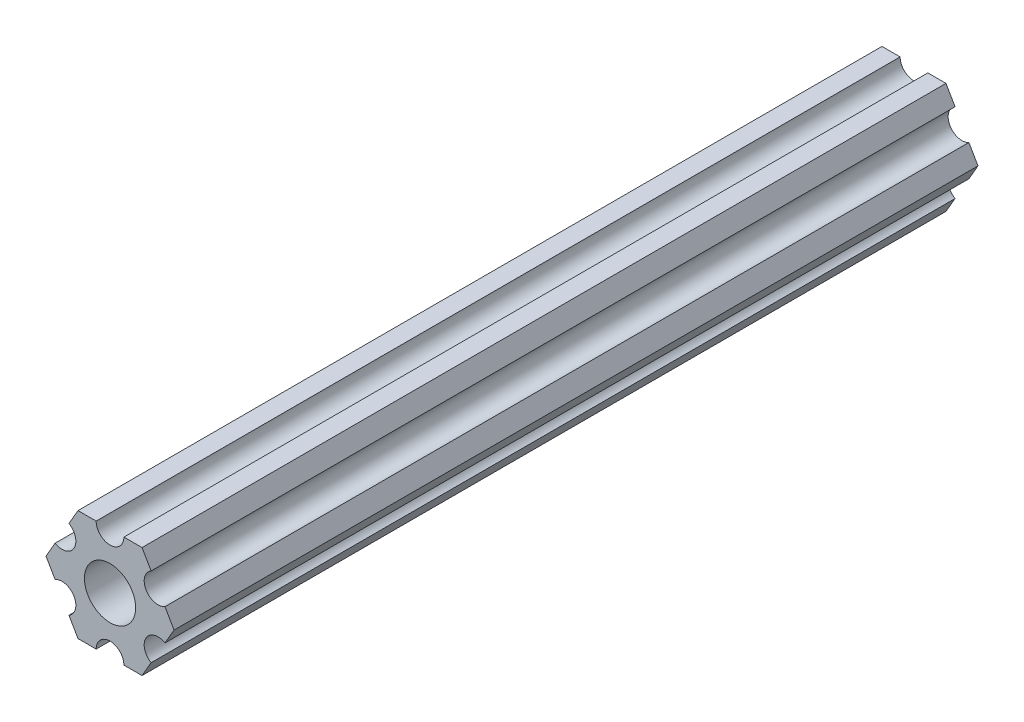
ISO-10303-21;
HEADER;
FILE_DESCRIPTION(('STEP AP214'),'2;1');
FILE_NAME('part.step','',(''),(''),'','','');
FILE_SCHEMA(('AUTOMOTIVE_DESIGN { 1 0 10303 214 1 1 1 1 }'));
ENDSEC;
DATA;
#1=APPLICATION_CONTEXT('core data for automotive mechanical design processes');
#2=APPLICATION_PROTOCOL_DEFINITION('international standard','automotive_design',2000,#1);
#3=PRODUCT_CONTEXT('',#1,'mechanical');
#4=PRODUCT('Part','Part','',(#3));
#5=PRODUCT_RELATED_PRODUCT_CATEGORY('part','',(#4));
#6=PRODUCT_DEFINITION_FORMATION('','',#4);
#7=PRODUCT_DEFINITION_CONTEXT('part definition',#1,'design');
#8=PRODUCT_DEFINITION('design','',#6,#7);
#9=PRODUCT_DEFINITION_SHAPE('','',#8);
#10=(LENGTH_UNIT() NAMED_UNIT(*) SI_UNIT(.MILLI.,.METRE.));
#11=(NAMED_UNIT(*) PLANE_ANGLE_UNIT() SI_UNIT($,.RADIAN.));
#12=(NAMED_UNIT(*) SI_UNIT($,.STERADIAN.) SOLID_ANGLE_UNIT());
#13=UNCERTAINTY_MEASURE_WITH_UNIT(LENGTH_MEASURE(1.E-05),#10,'distance_accuracy_value','');
#14=(GEOMETRIC_REPRESENTATION_CONTEXT(3) GLOBAL_UNCERTAINTY_ASSIGNED_CONTEXT((#13)) GLOBAL_UNIT_ASSIGNED_CONTEXT((#10,
#11,#12)) REPRESENTATION_CONTEXT('',''));
#15=CARTESIAN_POINT('',(0.,0.,0.));
#16=DIRECTION('',(0.,0.,1.));
#17=DIRECTION('',(1.,0.,0.));
#18=AXIS2_PLACEMENT_3D('',#15,#16,#17);
#19=CARTESIAN_POINT('',(6.29301142309098,-1.80018429024546,514.35));
#20=DIRECTION('',(-0.866025434075723,0.499999947533953,0.));
#21=DIRECTION('',(-0.499999947533953,-0.866025434075723,0.));
#22=AXIS2_PLACEMENT_3D('',#19,#20,#21);
#23=PLANE('',#22);
#24=DIRECTION('',(0.499999947533952,0.866025434075723,0.));
#25=VECTOR('',#24,1.);
#26=CARTESIAN_POINT('',(6.29301142309098,-1.80018429024546,92.075));
#27=LINE('',#26,#25);
#28=CARTESIAN_POINT('',(6.29301142309098,-1.80018429024546,92.075));
#29=VERTEX_POINT('',#28);
#30=CARTESIAN_POINT('',(7.33234841870826,4.44212519315656E-07,92.075));
#31=VERTEX_POINT('',#30);
#32=EDGE_CURVE('E349',#29,#31,#27,.T.);
#33=ORIENTED_EDGE('',*,*,#32,.F.);
#34=DIRECTION('',(0.,0.,-1.));
#35=VECTOR('',#34,1.);
#36=CARTESIAN_POINT('',(6.29301142309098,-1.80018429024546,514.35));
#37=LINE('',#36,#35);
#38=CARTESIAN_POINT('',(6.29301142309098,-1.80018429024546,0.));
#39=VERTEX_POINT('',#38);
#40=EDGE_CURVE('E59',#29,#39,#37,.T.);
#41=ORIENTED_EDGE('',*,*,#40,.T.);
#42=DIRECTION('',(0.499999947533953,0.866025434075723,0.));
#43=VECTOR('',#42,1.);
#44=CARTESIAN_POINT('',(6.29301142309098,-1.80018429024546,0.));
#45=LINE('',#44,#43);
#46=CARTESIAN_POINT('',(7.33234841870826,4.44212518961143E-07,0.));
#47=VERTEX_POINT('',#46);
#48=EDGE_CURVE('E42',#39,#47,#45,.T.);
#49=ORIENTED_EDGE('',*,*,#48,.T.);
#50=DIRECTION('',(0.,0.,1.));
#51=VECTOR('',#50,1.);
#52=CARTESIAN_POINT('',(7.33234841870826,4.44212519169686E-07,514.35));
#53=LINE('',#52,#51);
#54=EDGE_CURVE('E221',#47,#31,#53,.T.);
#55=ORIENTED_EDGE('',*,*,#54,.T.);
#56=EDGE_LOOP('',(#33,#41,#49,#55));
#57=FACE_BOUND('',#56,.T.);
#58=ADVANCED_FACE('F34',(#57),#23,.F.);
#59=CARTESIAN_POINT('',(7.33234841870826,4.44212519169686E-07,514.35));
#60=DIRECTION('',(-0.866025373493145,-0.500000052466056,0.));
#61=DIRECTION('',(0.500000052466056,-0.866025373493145,0.));
#62=AXIS2_PLACEMENT_3D('',#59,#60,#61);
#63=PLANE('',#62);
#64=DIRECTION('',(-0.500000052466056,0.866025373493145,0.));
#65=VECTOR('',#64,1.);
#66=CARTESIAN_POINT('',(7.33234841870826,4.44212519315656E-07,92.075));
#67=LINE('',#66,#65);
#68=CARTESIAN_POINT('',(6.29301120497139,1.80018505273895,92.075));
#69=VERTEX_POINT('',#68);
#70=EDGE_CURVE('E348',#31,#69,#67,.T.);
#71=ORIENTED_EDGE('',*,*,#70,.F.);
#72=ORIENTED_EDGE('',*,*,#54,.F.);
#73=DIRECTION('',(-0.500000052466056,0.866025373493145,0.));
#74=VECTOR('',#73,1.);
#75=CARTESIAN_POINT('',(7.33234841870826,4.44212519198905E-07,0.));
#76=LINE('',#75,#74);
#77=CARTESIAN_POINT('',(6.29301120497139,1.80018505273895,0.));
#78=VERTEX_POINT('',#77);
#79=EDGE_CURVE('E261',#47,#78,#76,.T.);
#80=ORIENTED_EDGE('',*,*,#79,.T.);
#81=DIRECTION('',(0.,0.,-1.));
#82=VECTOR('',#81,1.);
#83=CARTESIAN_POINT('',(6.29301120497139,1.80018505273895,514.35));
#84=LINE('',#83,#82);
#85=EDGE_CURVE('E218',#78,#69,#84,.F.);
#86=ORIENTED_EDGE('',*,*,#85,.T.);
#87=EDGE_LOOP('',(#71,#72,#80,#86));
#88=FACE_BOUND('',#87,.T.);
#89=ADVANCED_FACE('F347',(#88),#63,.F.);
#90=CARTESIAN_POINT('',(5.49926112168156,3.17500033315933,514.35));
#91=DIRECTION('',(0.,0.,-1.));
#92=DIRECTION('',(-1.,0.,0.));
#93=AXIS2_PLACEMENT_3D('',#90,#91,#92);
#94=CYLINDRICAL_SURFACE('',#93,1.5875);
#95=CARTESIAN_POINT('',(5.49926112168156,3.17500033315933,92.075));
#96=DIRECTION('',(0.,0.,-1.));
#97=DIRECTION('',(1.,0.,0.));
#98=AXIS2_PLACEMENT_3D('',#95,#96,#97);
#99=CIRCLE('',#98,1.5875);
#100=CARTESIAN_POINT('',(4.70551103839172,4.54981561357972,92.075));
#101=VERTEX_POINT('',#100);
#102=EDGE_CURVE('E392',#69,#101,#99,.T.);
#103=ORIENTED_EDGE('',*,*,#102,.F.);
#104=ORIENTED_EDGE('',*,*,#85,.F.);
#105=CARTESIAN_POINT('',(5.49926112168156,3.17500033315933,0.));
#106=DIRECTION('',(0.,0.,-1.));
#107=DIRECTION('',(-1.,0.,0.));
#108=AXIS2_PLACEMENT_3D('',#105,#106,#107);
#109=CIRCLE('',#108,1.5875);
#110=CARTESIAN_POINT('',(4.70551103839172,4.54981561357972,0.));
#111=VERTEX_POINT('',#110);
#112=EDGE_CURVE('E37',#78,#111,#109,.T.);
#113=ORIENTED_EDGE('',*,*,#112,.T.);
#114=DIRECTION('',(0.,0.,1.));
#115=VECTOR('',#114,1.);
#116=CARTESIAN_POINT('',(4.70551103839172,4.54981561357972,514.35));
#117=LINE('',#116,#115);
#118=EDGE_CURVE('E214',#111,#101,#117,.T.);
#119=ORIENTED_EDGE('',*,*,#118,.T.);
#120=EDGE_LOOP('',(#103,#104,#113,#119));
#121=FACE_BOUND('',#120,.T.);
#122=ADVANCED_FACE('F395',(#121),#94,.F.);
#123=CARTESIAN_POINT('',(4.70551103839172,4.54981561357972,514.35));
#124=DIRECTION('',(-0.866025373493151,-0.500000052466046,0.));
#125=DIRECTION('',(0.500000052466046,-0.866025373493151,0.));
#126=AXIS2_PLACEMENT_3D('',#123,#124,#125);
#127=PLANE('',#126);
#128=DIRECTION('',(-0.500000052466045,0.866025373493151,0.));
#129=VECTOR('',#128,1.);
#130=CARTESIAN_POINT('',(4.70551103839172,4.54981561357972,92.075));
#131=LINE('',#130,#129);
#132=CARTESIAN_POINT('',(3.66617382465481,6.35000022210627,92.075));
#133=VERTEX_POINT('',#132);
#134=EDGE_CURVE('E337',#101,#133,#131,.T.);
#135=ORIENTED_EDGE('',*,*,#134,.F.);
#136=ORIENTED_EDGE('',*,*,#118,.F.);
#137=DIRECTION('',(-0.500000052466046,0.866025373493151,0.));
#138=VECTOR('',#137,1.);
#139=CARTESIAN_POINT('',(4.70551103839172,4.54981561357972,0.));
#140=LINE('',#139,#138);
#141=CARTESIAN_POINT('',(3.66617382465481,6.35000022210627,-1.11022302462516E-13));
#142=VERTEX_POINT('',#141);
#143=EDGE_CURVE('E250',#111,#142,#140,.T.);
#144=ORIENTED_EDGE('',*,*,#143,.T.);
#145=DIRECTION('',(0.,0.,1.));
#146=VECTOR('',#145,1.);
#147=CARTESIAN_POINT('',(3.66617382465481,6.35000022210627,514.35));
#148=LINE('',#147,#146);
#149=EDGE_CURVE('E109',#142,#133,#148,.T.);
#150=ORIENTED_EDGE('',*,*,#149,.T.);
#151=EDGE_LOOP('',(#135,#136,#144,#150));
#152=FACE_BOUND('',#151,.T.);
#153=ADVANCED_FACE('F341',(#152),#127,.F.);
#154=CARTESIAN_POINT('',(3.66617382465481,6.35000022210627,514.35));
#155=DIRECTION('',(6.05825850611185E-08,-0.999999999999998,0.));
#156=DIRECTION('',(0.999999999999998,6.05825850611185E-08,0.));
#157=AXIS2_PLACEMENT_3D('',#154,#155,#156);
#158=PLANE('',#157);
#159=DIRECTION('',(-1.,-3.02912927391926E-08,0.));
#160=VECTOR('',#159,1.);
#161=CARTESIAN_POINT('',(3.66617382465481,6.35000022210627,92.075));
#162=LINE('',#161,#160);
#163=CARTESIAN_POINT('',(1.58749961530073,6.35000015914054,92.075));
#164=VERTEX_POINT('',#163);
#165=EDGE_CURVE('E334',#133,#164,#162,.T.);
#166=ORIENTED_EDGE('',*,*,#165,.F.);
#167=ORIENTED_EDGE('',*,*,#149,.F.);
#168=DIRECTION('',(1.,0.,0.));
#169=VECTOR('',#168,1.);
#170=CARTESIAN_POINT('',(5.49926112168156,6.35000022210627,0.));
#171=LINE('',#170,#169);
#172=CARTESIAN_POINT('',(1.58749961530073,6.35000015914054,0.));
#173=VERTEX_POINT('',#172);
#174=EDGE_CURVE('E245',#142,#173,#171,.F.);
#175=ORIENTED_EDGE('',*,*,#174,.T.);
#176=DIRECTION('',(0.,0.,-1.));
#177=VECTOR('',#176,1.);
#178=CARTESIAN_POINT('',(1.58749961530074,6.35000009617482,514.35));
#179=LINE('',#178,#177);
#180=EDGE_CURVE('E210',#173,#164,#179,.F.);
#181=ORIENTED_EDGE('',*,*,#180,.T.);
#182=EDGE_LOOP('',(#166,#167,#175,#181));
#183=FACE_BOUND('',#182,.T.);
#184=ADVANCED_FACE('F336',(#183),#158,.F.);
#185=CARTESIAN_POINT('',(-3.84699260060323E-07,6.35,514.35));
#186=DIRECTION('',(0.,0.,-1.));
#187=DIRECTION('',(-1.,0.,0.));
#188=AXIS2_PLACEMENT_3D('',#185,#186,#187);
#189=CYLINDRICAL_SURFACE('',#188,1.5875);
#190=CARTESIAN_POINT('',(-3.84699260060323E-07,6.35,92.075));
#191=DIRECTION('',(0.,0.,-1.));
#192=DIRECTION('',(1.,0.,0.));
#193=AXIS2_PLACEMENT_3D('',#190,#191,#192);
#194=CIRCLE('',#193,1.5875);
#195=CARTESIAN_POINT('',(-1.58750038469926,6.34999990382519,92.075));
#196=VERTEX_POINT('',#195);
#197=EDGE_CURVE('E333',#164,#196,#194,.T.);
#198=ORIENTED_EDGE('',*,*,#197,.F.);
#199=ORIENTED_EDGE('',*,*,#180,.F.);
#200=CARTESIAN_POINT('',(-3.84699260060323E-07,6.35,0.));
#201=DIRECTION('',(0.,0.,-1.));
#202=DIRECTION('',(-1.,0.,0.));
#203=AXIS2_PLACEMENT_3D('',#200,#201,#202);
#204=CIRCLE('',#203,1.5875);
#205=CARTESIAN_POINT('',(-1.58750038469926,6.34999990382518,0.));
#206=VERTEX_POINT('',#205);
#207=EDGE_CURVE('E242',#173,#206,#204,.T.);
#208=ORIENTED_EDGE('',*,*,#207,.T.);
#209=DIRECTION('',(0.,0.,1.));
#210=VECTOR('',#209,1.);
#211=CARTESIAN_POINT('',(-1.58750038469926,6.34999990382518,514.35));
#212=LINE('',#211,#210);
#213=EDGE_CURVE('E205',#206,#196,#212,.T.);
#214=ORIENTED_EDGE('',*,*,#213,.T.);
#215=EDGE_LOOP('',(#198,#199,#208,#214));
#216=FACE_BOUND('',#215,.T.);
#217=ADVANCED_FACE('F332',(#216),#189,.F.);
#218=CARTESIAN_POINT('',(-1.58750038469926,6.34999990382518,514.35));
#219=DIRECTION('',(6.05825963273174E-08,-0.999999999999998,0.));
#220=DIRECTION('',(0.999999999999998,6.05825963273174E-08,0.));
#221=AXIS2_PLACEMENT_3D('',#218,#219,#220);
#222=PLANE('',#221);
#223=DIRECTION('',(-1.,-2.0194198968488E-08,0.));
#224=VECTOR('',#223,1.);
#225=CARTESIAN_POINT('',(-1.58750038469926,6.34999990382518,92.075));
#226=LINE('',#225,#224);
#227=CARTESIAN_POINT('',(-3.66617454558244,6.34999986184803,92.075));
#228=VERTEX_POINT('',#227);
#229=EDGE_CURVE('E330',#196,#228,#226,.T.);
#230=ORIENTED_EDGE('',*,*,#229,.F.);
#231=ORIENTED_EDGE('',*,*,#213,.F.);
#232=DIRECTION('',(1.,0.,0.));
#233=VECTOR('',#232,1.);
#234=CARTESIAN_POINT('',(5.49926112168156,6.34999990382518,0.));
#235=LINE('',#234,#233);
#236=CARTESIAN_POINT('',(-3.66617454558244,6.34999986184803,-1.11022302462516E-13));
#237=VERTEX_POINT('',#236);
#238=EDGE_CURVE('E244',#206,#237,#235,.F.);
#239=ORIENTED_EDGE('',*,*,#238,.T.);
#240=DIRECTION('',(0.,0.,1.));
#241=VECTOR('',#240,1.);
#242=CARTESIAN_POINT('',(-3.66617459405349,6.3499997778937,514.35));
#243=LINE('',#242,#241);
#244=EDGE_CURVE('E198',#237,#228,#243,.T.);
#245=ORIENTED_EDGE('',*,*,#244,.T.);
#246=EDGE_LOOP('',(#230,#231,#239,#245));
#247=FACE_BOUND('',#246,.T.);
#248=ADVANCED_FACE('F329',(#247),#222,.F.);
#249=CARTESIAN_POINT('',(-3.66617459405349,6.3499997778937,514.35));
#250=DIRECTION('',(0.866025434075729,-0.499999947533942,0.));
#251=DIRECTION('',(0.499999947533942,0.866025434075729,0.));
#252=AXIS2_PLACEMENT_3D('',#249,#250,#251);
#253=PLANE('',#252);
#254=DIRECTION('',(-0.499999947533942,-0.866025434075729,0.));
#255=VECTOR('',#254,1.);
#256=CARTESIAN_POINT('',(-3.66617454558244,6.34999986184803,92.075));
#257=LINE('',#256,#255);
#258=CARTESIAN_POINT('',(-4.70551158967065,4.54981504343587,92.075));
#259=VERTEX_POINT('',#258);
#260=EDGE_CURVE('E175',#228,#259,#257,.T.);
#261=ORIENTED_EDGE('',*,*,#260,.F.);
#262=ORIENTED_EDGE('',*,*,#244,.F.);
#263=DIRECTION('',(-0.499999947533943,-0.866025434075729,0.));
#264=VECTOR('',#263,1.);
#265=CARTESIAN_POINT('',(-3.66617459405349,6.3499997778937,0.));
#266=LINE('',#265,#264);
#267=CARTESIAN_POINT('',(-4.70551158967065,4.54981504343587,0.));
#268=VERTEX_POINT('',#267);
#269=EDGE_CURVE('E241',#237,#268,#266,.T.);
#270=ORIENTED_EDGE('',*,*,#269,.T.);
#271=DIRECTION('',(0.,0.,-1.));
#272=VECTOR('',#271,1.);
#273=CARTESIAN_POINT('',(-4.70551158967065,4.54981504343587,514.35));
#274=LINE('',#273,#272);
#275=EDGE_CURVE('E194',#268,#259,#274,.F.);
#276=ORIENTED_EDGE('',*,*,#275,.T.);
#277=EDGE_LOOP('',(#261,#262,#270,#276));
#278=FACE_BOUND('',#277,.T.);
#279=ADVANCED_FACE('F325',(#278),#253,.F.);
#280=CARTESIAN_POINT('',(-5.49926150638082,3.17499966684067,514.35));
#281=DIRECTION('',(0.,0.,-1.));
#282=DIRECTION('',(-1.,0.,0.));
#283=AXIS2_PLACEMENT_3D('',#280,#281,#282);
#284=CYLINDRICAL_SURFACE('',#283,1.5875);
#285=CARTESIAN_POINT('',(-5.49926150638082,3.17499966684067,92.075));
#286=DIRECTION('',(0.,0.,-1.));
#287=DIRECTION('',(1.,0.,0.));
#288=AXIS2_PLACEMENT_3D('',#285,#286,#287);
#289=CIRCLE('',#288,1.5875);
#290=CARTESIAN_POINT('',(-6.29301142309098,1.80018429024547,92.075));
#291=VERTEX_POINT('',#290);
#292=EDGE_CURVE('E169',#259,#291,#289,.T.);
#293=ORIENTED_EDGE('',*,*,#292,.F.);
#294=ORIENTED_EDGE('',*,*,#275,.F.);
#295=CARTESIAN_POINT('',(-5.49926150638082,3.17499966684067,0.));
#296=DIRECTION('',(0.,0.,-1.));
#297=DIRECTION('',(-1.,0.,0.));
#298=AXIS2_PLACEMENT_3D('',#295,#296,#297);
#299=CIRCLE('',#298,1.5875);
#300=CARTESIAN_POINT('',(-6.29301142309098,1.80018429024547,0.));
#301=VERTEX_POINT('',#300);
#302=EDGE_CURVE('E193',#268,#301,#299,.T.);
#303=ORIENTED_EDGE('',*,*,#302,.T.);
#304=DIRECTION('',(0.,0.,1.));
#305=VECTOR('',#304,1.);
#306=CARTESIAN_POINT('',(-6.29301142309098,1.80018429024547,514.35));
#307=LINE('',#306,#305);
#308=EDGE_CURVE('E185',#301,#291,#307,.T.);
#309=ORIENTED_EDGE('',*,*,#308,.T.);
#310=EDGE_LOOP('',(#293,#294,#303,#309));
#311=FACE_BOUND('',#310,.T.);
#312=ADVANCED_FACE('F191',(#311),#284,.F.);
#313=CARTESIAN_POINT('',(-6.29301142309098,1.80018429024547,514.35));
#314=DIRECTION('',(0.866025434075724,-0.499999947533951,0.));
#315=DIRECTION('',(0.499999947533951,0.866025434075724,0.));
#316=AXIS2_PLACEMENT_3D('',#313,#314,#315);
#317=PLANE('',#316);
#318=DIRECTION('',(-0.499999947533951,-0.866025434075724,0.));
#319=VECTOR('',#318,1.);
#320=CARTESIAN_POINT('',(-6.29301142309098,1.80018429024547,92.075));
#321=LINE('',#320,#319);
#322=CARTESIAN_POINT('',(-7.33234841870826,-4.44212524036367E-07,92.075));
#323=VERTEX_POINT('',#322);
#324=EDGE_CURVE('E172',#291,#323,#321,.T.);
#325=ORIENTED_EDGE('',*,*,#324,.F.);
#326=ORIENTED_EDGE('',*,*,#308,.F.);
#327=DIRECTION('',(-0.499999947533952,-0.866025434075724,0.));
#328=VECTOR('',#327,1.);
#329=CARTESIAN_POINT('',(-6.29301142309098,1.80018429024547,0.));
#330=LINE('',#329,#328);
#331=CARTESIAN_POINT('',(-7.33234841870826,-4.44212524036367E-07,0.));
#332=VERTEX_POINT('',#331);
#333=EDGE_CURVE('E240',#301,#332,#330,.T.);
#334=ORIENTED_EDGE('',*,*,#333,.T.);
#335=DIRECTION('',(0.,0.,1.));
#336=VECTOR('',#335,1.);
#337=CARTESIAN_POINT('',(-7.33234841870826,-4.44212523790841E-07,514.35));
#338=LINE('',#337,#336);
#339=EDGE_CURVE('E187',#332,#323,#338,.T.);
#340=ORIENTED_EDGE('',*,*,#339,.T.);
#341=EDGE_LOOP('',(#325,#326,#334,#340));
#342=FACE_BOUND('',#341,.T.);
#343=ADVANCED_FACE('F183',(#342),#317,.F.);
#344=CARTESIAN_POINT('',(-7.33234841870826,-4.44212523790841E-07,514.35));
#345=DIRECTION('',(0.866025373493151,0.500000052466045,0.));
#346=DIRECTION('',(-0.500000052466045,0.866025373493151,0.));
#347=AXIS2_PLACEMENT_3D('',#344,#345,#346);
#348=PLANE('',#347);
#349=DIRECTION('',(0.500000052466045,-0.866025373493151,0.));
#350=VECTOR('',#349,1.);
#351=CARTESIAN_POINT('',(-7.33234841870826,-4.44212524036367E-07,92.075));
#352=LINE('',#351,#350);
#353=CARTESIAN_POINT('',(-6.29301120497141,-1.80018505273896,92.075));
#354=VERTEX_POINT('',#353);
#355=EDGE_CURVE('E188',#323,#354,#352,.T.);
#356=ORIENTED_EDGE('',*,*,#355,.F.);
#357=ORIENTED_EDGE('',*,*,#339,.F.);
#358=DIRECTION('',(0.500000052466045,-0.866025373493151,0.));
#359=VECTOR('',#358,1.);
#360=CARTESIAN_POINT('',(-7.33234841870826,-4.44212523969395E-07,0.));
#361=LINE('',#360,#359);
#362=CARTESIAN_POINT('',(-6.29301120497141,-1.80018505273896,0.));
#363=VERTEX_POINT('',#362);
#364=EDGE_CURVE('E239',#332,#363,#361,.T.);
#365=ORIENTED_EDGE('',*,*,#364,.T.);
#366=DIRECTION('',(0.,0.,-1.));
#367=VECTOR('',#366,1.);
#368=CARTESIAN_POINT('',(-6.29301120497141,-1.80018505273896,514.35));
#369=LINE('',#368,#367);
#370=EDGE_CURVE('E196',#363,#354,#369,.F.);
#371=ORIENTED_EDGE('',*,*,#370,.T.);
#372=EDGE_LOOP('',(#356,#357,#365,#371));
#373=FACE_BOUND('',#372,.T.);
#374=ADVANCED_FACE('F291',(#373),#348,.F.);
#375=CARTESIAN_POINT('',(-5.49926112168156,-3.17500033315934,514.35));
#376=DIRECTION('',(0.,0.,-1.));
#377=DIRECTION('',(-1.,0.,0.));
#378=AXIS2_PLACEMENT_3D('',#375,#376,#377);
#379=CYLINDRICAL_SURFACE('',#378,1.5875);
#380=CARTESIAN_POINT('',(-5.49926112168156,-3.17500033315934,92.075));
#381=DIRECTION('',(0.,0.,-1.));
#382=DIRECTION('',(1.,0.,0.));
#383=AXIS2_PLACEMENT_3D('',#380,#381,#382);
#384=CIRCLE('',#383,1.5875);
#385=CARTESIAN_POINT('',(-4.70551103839172,-4.54981561357972,92.075));
#386=VERTEX_POINT('',#385);
#387=EDGE_CURVE('E297',#354,#386,#384,.T.);
#388=ORIENTED_EDGE('',*,*,#387,.F.);
#389=ORIENTED_EDGE('',*,*,#370,.F.);
#390=CARTESIAN_POINT('',(-5.49926112168156,-3.17500033315934,0.));
#391=DIRECTION('',(0.,0.,-1.));
#392=DIRECTION('',(-1.,0.,0.));
#393=AXIS2_PLACEMENT_3D('',#390,#391,#392);
#394=CIRCLE('',#393,1.5875);
#395=CARTESIAN_POINT('',(-4.70551103839172,-4.54981561357972,0.));
#396=VERTEX_POINT('',#395);
#397=EDGE_CURVE('E235',#363,#396,#394,.T.);
#398=ORIENTED_EDGE('',*,*,#397,.T.);
#399=DIRECTION('',(0.,0.,1.));
#400=VECTOR('',#399,1.);
#401=CARTESIAN_POINT('',(-4.70551103839172,-4.54981561357972,514.35));
#402=LINE('',#401,#400);
#403=EDGE_CURVE('E283',#396,#386,#402,.T.);
#404=ORIENTED_EDGE('',*,*,#403,.T.);
#405=EDGE_LOOP('',(#388,#389,#398,#404));
#406=FACE_BOUND('',#405,.T.);
#407=ADVANCED_FACE('F296',(#406),#379,.F.);
#408=CARTESIAN_POINT('',(-4.70551103839172,-4.54981561357972,514.35));
#409=DIRECTION('',(0.866025373493151,0.500000052466045,0.));
#410=DIRECTION('',(-0.500000052466045,0.866025373493151,0.));
#411=AXIS2_PLACEMENT_3D('',#408,#409,#410);
#412=PLANE('',#411);
#413=DIRECTION('',(0.500000052466045,-0.866025373493151,0.));
#414=VECTOR('',#413,1.);
#415=CARTESIAN_POINT('',(-4.70551103839172,-4.54981561357972,92.075));
#416=LINE('',#415,#414);
#417=CARTESIAN_POINT('',(-3.6661738246548,-6.35000022210628,92.075));
#418=VERTEX_POINT('',#417);
#419=EDGE_CURVE('E378',#386,#418,#416,.T.);
#420=ORIENTED_EDGE('',*,*,#419,.F.);
#421=ORIENTED_EDGE('',*,*,#403,.F.);
#422=DIRECTION('',(0.500000052466045,-0.866025373493151,0.));
#423=VECTOR('',#422,1.);
#424=CARTESIAN_POINT('',(-4.70551103839172,-4.54981561357972,0.));
#425=LINE('',#424,#423);
#426=CARTESIAN_POINT('',(-3.6661738246548,-6.35000022210628,-1.11022302462516E-13));
#427=VERTEX_POINT('',#426);
#428=EDGE_CURVE('E238',#396,#427,#425,.T.);
#429=ORIENTED_EDGE('',*,*,#428,.T.);
#430=DIRECTION('',(0.,0.,1.));
#431=VECTOR('',#430,1.);
#432=CARTESIAN_POINT('',(-3.66617382465481,-6.35000022210628,514.35));
#433=LINE('',#432,#431);
#434=EDGE_CURVE('E280',#427,#418,#433,.T.);
#435=ORIENTED_EDGE('',*,*,#434,.T.);
#436=EDGE_LOOP('',(#420,#421,#429,#435));
#437=FACE_BOUND('',#436,.T.);
#438=ADVANCED_FACE('F377',(#437),#412,.F.);
#439=CARTESIAN_POINT('',(-3.66617382465481,-6.35000022210628,514.35));
#440=DIRECTION('',(-6.05825854783851E-08,0.999999999999998,0.));
#441=DIRECTION('',(-0.999999999999998,-6.05825854783851E-08,0.));
#442=AXIS2_PLACEMENT_3D('',#439,#440,#441);
#443=PLANE('',#442);
#444=DIRECTION('',(0.999999999999998,5.34249835485697E-08,0.));
#445=VECTOR('',#444,1.);
#446=CARTESIAN_POINT('',(-3.6661738246548,-6.35000022210628,92.075));
#447=LINE('',#446,#445);
#448=CARTESIAN_POINT('',(-1.58749961530073,-6.35000011105314,92.075));
#449=VERTEX_POINT('',#448);
#450=EDGE_CURVE('E375',#418,#449,#447,.T.);
#451=ORIENTED_EDGE('',*,*,#450,.F.);
#452=ORIENTED_EDGE('',*,*,#434,.F.);
#453=DIRECTION('',(1.,0.,0.));
#454=VECTOR('',#453,1.);
#455=CARTESIAN_POINT('',(5.49926112168156,-6.35000022210628,0.));
#456=LINE('',#455,#454);
#457=CARTESIAN_POINT('',(-1.58749961530073,-6.35000011105314,0.));
#458=VERTEX_POINT('',#457);
#459=EDGE_CURVE('E234',#427,#458,#456,.T.);
#460=ORIENTED_EDGE('',*,*,#459,.T.);
#461=DIRECTION('',(0.,0.,-1.));
#462=VECTOR('',#461,1.);
#463=CARTESIAN_POINT('',(-1.58749961530074,-6.35,514.35));
#464=LINE('',#463,#462);
#465=EDGE_CURVE('E277',#458,#449,#464,.F.);
#466=ORIENTED_EDGE('',*,*,#465,.T.);
#467=EDGE_LOOP('',(#451,#452,#460,#466));
#468=FACE_BOUND('',#467,.T.);
#469=ADVANCED_FACE('F374',(#468),#443,.F.);
#470=CARTESIAN_POINT('',(3.8469926204343E-07,-6.35,514.35));
#471=DIRECTION('',(0.,0.,-1.));
#472=DIRECTION('',(-1.,0.,0.));
#473=AXIS2_PLACEMENT_3D('',#470,#471,#472);
#474=CYLINDRICAL_SURFACE('',#473,1.5875);
#475=CARTESIAN_POINT('',(3.8469926204343E-07,-6.35,92.075));
#476=DIRECTION('',(0.,0.,-1.));
#477=DIRECTION('',(1.,0.,0.));
#478=AXIS2_PLACEMENT_3D('',#475,#476,#477);
#479=CIRCLE('',#478,1.5875);
#480=CARTESIAN_POINT('',(1.58750038469926,-6.34999990382518,92.075));
#481=VERTEX_POINT('',#480);
#482=EDGE_CURVE('E371',#449,#481,#479,.T.);
#483=ORIENTED_EDGE('',*,*,#482,.F.);
#484=ORIENTED_EDGE('',*,*,#465,.F.);
#485=CARTESIAN_POINT('',(3.8469926204343E-07,-6.35,0.));
#486=DIRECTION('',(0.,0.,-1.));
#487=DIRECTION('',(-1.,0.,0.));
#488=AXIS2_PLACEMENT_3D('',#485,#486,#487);
#489=CIRCLE('',#488,1.5875);
#490=CARTESIAN_POINT('',(1.58750038469926,-6.34999990382518,0.));
#491=VERTEX_POINT('',#490);
#492=EDGE_CURVE('E230',#458,#491,#489,.T.);
#493=ORIENTED_EDGE('',*,*,#492,.T.);
#494=DIRECTION('',(0.,0.,1.));
#495=VECTOR('',#494,1.);
#496=CARTESIAN_POINT('',(1.58750038469926,-6.34999990382518,514.35));
#497=LINE('',#496,#495);
#498=EDGE_CURVE('E272',#491,#481,#497,.T.);
#499=ORIENTED_EDGE('',*,*,#498,.T.);
#500=EDGE_LOOP('',(#483,#484,#493,#499));
#501=FACE_BOUND('',#500,.T.);
#502=ADVANCED_FACE('F370',(#501),#474,.F.);
#503=CARTESIAN_POINT('',(1.58750038469926,-6.34999990382518,514.35));
#504=DIRECTION('',(-6.05825721258438E-08,0.999999999999998,0.));
#505=DIRECTION('',(-0.999999999999998,-6.05825721258438E-08,0.));
#506=AXIS2_PLACEMENT_3D('',#503,#504,#505);
#507=PLANE('',#506);
#508=DIRECTION('',(1.,2.01941910404187E-08,0.));
#509=VECTOR('',#508,1.);
#510=CARTESIAN_POINT('',(1.58750038469926,-6.34999990382518,92.075));
#511=LINE('',#510,#509);
#512=CARTESIAN_POINT('',(3.66617454558244,-6.34999986184804,92.075));
#513=VERTEX_POINT('',#512);
#514=EDGE_CURVE('E385',#481,#513,#511,.T.);
#515=ORIENTED_EDGE('',*,*,#514,.F.);
#516=ORIENTED_EDGE('',*,*,#498,.F.);
#517=DIRECTION('',(1.,0.,0.));
#518=VECTOR('',#517,1.);
#519=CARTESIAN_POINT('',(5.49926112168156,-6.34999990382518,0.));
#520=LINE('',#519,#518);
#521=CARTESIAN_POINT('',(3.66617454558244,-6.34999986184804,-1.11022302462516E-13));
#522=VERTEX_POINT('',#521);
#523=EDGE_CURVE('E233',#491,#522,#520,.T.);
#524=ORIENTED_EDGE('',*,*,#523,.T.);
#525=DIRECTION('',(0.,0.,1.));
#526=VECTOR('',#525,1.);
#527=CARTESIAN_POINT('',(3.66617459405346,-6.34999977789375,514.35));
#528=LINE('',#527,#526);
#529=EDGE_CURVE('E269',#522,#513,#528,.T.);
#530=ORIENTED_EDGE('',*,*,#529,.T.);
#531=EDGE_LOOP('',(#515,#516,#524,#530));
#532=FACE_BOUND('',#531,.T.);
#533=ADVANCED_FACE('F366',(#532),#507,.F.);
#534=CARTESIAN_POINT('',(3.66617459405346,-6.34999977789375,514.35));
#535=DIRECTION('',(-0.86602543407573,0.499999947533941,0.));
#536=DIRECTION('',(-0.499999947533941,-0.86602543407573,0.));
#537=AXIS2_PLACEMENT_3D('',#534,#535,#536);
#538=PLANE('',#537);
#539=DIRECTION('',(0.49999994753394,0.86602543407573,0.));
#540=VECTOR('',#539,1.);
#541=CARTESIAN_POINT('',(3.66617454558244,-6.34999986184804,92.075));
#542=LINE('',#541,#540);
#543=CARTESIAN_POINT('',(4.70551158967065,-4.54981504343587,92.0749999999997));
#544=VERTEX_POINT('',#543);
#545=EDGE_CURVE('E50',#513,#544,#542,.T.);
#546=ORIENTED_EDGE('',*,*,#545,.F.);
#547=ORIENTED_EDGE('',*,*,#529,.F.);
#548=DIRECTION('',(0.49999994753394,0.86602543407573,0.));
#549=VECTOR('',#548,1.);
#550=CARTESIAN_POINT('',(3.66617459405346,-6.34999977789376,0.));
#551=LINE('',#550,#549);
#552=CARTESIAN_POINT('',(4.70551158967065,-4.54981504343587,0.));
#553=VERTEX_POINT('',#552);
#554=EDGE_CURVE('E229',#522,#553,#551,.T.);
#555=ORIENTED_EDGE('',*,*,#554,.T.);
#556=DIRECTION('',(0.,0.,1.));
#557=VECTOR('',#556,1.);
#558=CARTESIAN_POINT('',(4.70551158967065,-4.54981504343587,514.35));
#559=LINE('',#558,#557);
#560=EDGE_CURVE('E267',#544,#553,#559,.F.);
#561=ORIENTED_EDGE('',*,*,#560,.F.);
#562=EDGE_LOOP('',(#546,#547,#555,#561));
#563=FACE_BOUND('',#562,.T.);
#564=ADVANCED_FACE('F518',(#563),#538,.F.);
#565=CARTESIAN_POINT('',(5.49926150638082,-3.17499966684067,514.35));
#566=DIRECTION('',(0.,0.,-1.));
#567=DIRECTION('',(-1.,0.,0.));
#568=AXIS2_PLACEMENT_3D('',#565,#566,#567);
#569=CYLINDRICAL_SURFACE('',#568,1.58750000000001);
#570=CARTESIAN_POINT('',(5.49926150638082,-3.17499966684067,92.075));
#571=DIRECTION('',(0.,0.,-1.));
#572=DIRECTION('',(1.,0.,0.));
#573=AXIS2_PLACEMENT_3D('',#570,#571,#572);
#574=CIRCLE('',#573,1.58750000000001);
#575=EDGE_CURVE('E388',#544,#29,#574,.T.);
#576=ORIENTED_EDGE('',*,*,#575,.F.);
#577=ORIENTED_EDGE('',*,*,#560,.T.);
#578=CARTESIAN_POINT('',(5.49926150638082,-3.17499966684067,0.));
#579=DIRECTION('',(0.,0.,-1.));
#580=DIRECTION('',(-1.,0.,0.));
#581=AXIS2_PLACEMENT_3D('',#578,#579,#580);
#582=CIRCLE('',#581,1.58750000000001);
#583=EDGE_CURVE('E226',#553,#39,#582,.T.);
#584=ORIENTED_EDGE('',*,*,#583,.T.);
#585=ORIENTED_EDGE('',*,*,#40,.F.);
#586=EDGE_LOOP('',(#576,#577,#584,#585));
#587=FACE_BOUND('',#586,.T.);
#588=ADVANCED_FACE('F527',(#587),#569,.F.);
#589=CARTESIAN_POINT('',(0.,0.,514.35));
#590=DIRECTION('',(0.,0.,-1.));
#591=DIRECTION('',(-1.,0.,0.));
#592=AXIS2_PLACEMENT_3D('',#589,#590,#591);
#593=CYLINDRICAL_SURFACE('',#592,2.9337);
#594=CARTESIAN_POINT('',(0.,0.,0.));
#595=DIRECTION('',(0.,0.,-1.));
#596=DIRECTION('',(-1.,0.,0.));
#597=AXIS2_PLACEMENT_3D('',#594,#595,#596);
#598=CIRCLE('',#597,2.9337);
#599=CARTESIAN_POINT('',(-2.9337,0.,0.));
#600=VERTEX_POINT('',#599);
#601=EDGE_CURVE('E11',#600,#600,#598,.F.);
#602=ORIENTED_EDGE('',*,*,#601,.F.);
#603=EDGE_LOOP('',(#602));
#604=FACE_BOUND('',#603,.T.);
#605=CARTESIAN_POINT('',(0.,0.,92.075));
#606=DIRECTION('',(0.,0.,1.));
#607=DIRECTION('',(1.,0.,0.));
#608=AXIS2_PLACEMENT_3D('',#605,#606,#607);
#609=CIRCLE('',#608,2.9337);
#610=CARTESIAN_POINT('',(2.9337,0.,92.075));
#611=VERTEX_POINT('',#610);
#612=EDGE_CURVE('E179',#611,#611,#609,.T.);
#613=ORIENTED_EDGE('',*,*,#612,.T.);
#614=EDGE_LOOP('',(#613));
#615=FACE_BOUND('',#614,.T.);
#616=ADVANCED_FACE('F537',(#604,#615),#593,.F.);
#617=CARTESIAN_POINT('',(5.49926112168156,3.17500033315933,0.));
#618=DIRECTION('',(0.,0.,1.));
#619=DIRECTION('',(1.,0.,0.));
#620=AXIS2_PLACEMENT_3D('',#617,#618,#619);
#621=PLANE('',#620);
#622=ORIENTED_EDGE('',*,*,#601,.T.);
#623=EDGE_LOOP('',(#622));
#624=FACE_BOUND('',#623,.T.);
#625=ORIENTED_EDGE('',*,*,#583,.F.);
#626=ORIENTED_EDGE('',*,*,#554,.F.);
#627=ORIENTED_EDGE('',*,*,#523,.F.);
#628=ORIENTED_EDGE('',*,*,#492,.F.);
#629=ORIENTED_EDGE('',*,*,#459,.F.);
#630=ORIENTED_EDGE('',*,*,#428,.F.);
#631=ORIENTED_EDGE('',*,*,#397,.F.);
#632=ORIENTED_EDGE('',*,*,#364,.F.);
#633=ORIENTED_EDGE('',*,*,#333,.F.);
#634=ORIENTED_EDGE('',*,*,#302,.F.);
#635=ORIENTED_EDGE('',*,*,#269,.F.);
#636=ORIENTED_EDGE('',*,*,#238,.F.);
#637=ORIENTED_EDGE('',*,*,#207,.F.);
#638=ORIENTED_EDGE('',*,*,#174,.F.);
#639=ORIENTED_EDGE('',*,*,#143,.F.);
#640=ORIENTED_EDGE('',*,*,#112,.F.);
#641=ORIENTED_EDGE('',*,*,#79,.F.);
#642=ORIENTED_EDGE('',*,*,#48,.F.);
#643=EDGE_LOOP('',(#625,#626,#627,#628,#629,#630,#631,#632,#633,#634,#635,#636,#637,#638,#639,
#640,#641,#642));
#644=FACE_BOUND('',#643,.T.);
#645=ADVANCED_FACE('F301',(#624,#644),#621,.F.);
#646=CARTESIAN_POINT('',(-5.49926150638082,3.17499966684067,92.075));
#647=DIRECTION('',(0.,0.,1.));
#648=DIRECTION('',(1.,0.,0.));
#649=AXIS2_PLACEMENT_3D('',#646,#647,#648);
#650=PLANE('',#649);
#651=ORIENTED_EDGE('',*,*,#612,.F.);
#652=EDGE_LOOP('',(#651));
#653=FACE_BOUND('',#652,.T.);
#654=ORIENTED_EDGE('',*,*,#292,.T.);
#655=ORIENTED_EDGE('',*,*,#324,.T.);
#656=ORIENTED_EDGE('',*,*,#355,.T.);
#657=ORIENTED_EDGE('',*,*,#387,.T.);
#658=ORIENTED_EDGE('',*,*,#419,.T.);
#659=ORIENTED_EDGE('',*,*,#450,.T.);
#660=ORIENTED_EDGE('',*,*,#482,.T.);
#661=ORIENTED_EDGE('',*,*,#514,.T.);
#662=ORIENTED_EDGE('',*,*,#545,.T.);
#663=ORIENTED_EDGE('',*,*,#575,.T.);
#664=ORIENTED_EDGE('',*,*,#32,.T.);
#665=ORIENTED_EDGE('',*,*,#70,.T.);
#666=ORIENTED_EDGE('',*,*,#102,.T.);
#667=ORIENTED_EDGE('',*,*,#134,.T.);
#668=ORIENTED_EDGE('',*,*,#165,.T.);
#669=ORIENTED_EDGE('',*,*,#197,.T.);
#670=ORIENTED_EDGE('',*,*,#229,.T.);
#671=ORIENTED_EDGE('',*,*,#260,.T.);
#672=EDGE_LOOP('',(#654,#655,#656,#657,#658,#659,#660,#661,#662,#663,#664,#665,#666,#667,#668,
#669,#670,#671));
#673=FACE_BOUND('',#672,.T.);
#674=ADVANCED_FACE('F171',(#653,#673),#650,.T.);
#675=CLOSED_SHELL('',(#58,#89,#122,#153,#184,#217,#248,#279,#312,#343,#374,#407,#438,#469,#502,
#533,#564,#588,#616,#645,#674));
#676=MANIFOLD_SOLID_BREP('B2',#675);
#677=ADVANCED_BREP_SHAPE_REPRESENTATION('',(#18,#676),#14);
#678=SHAPE_DEFINITION_REPRESENTATION(#9,#677);
ENDSEC;
END-ISO-10303-21;
